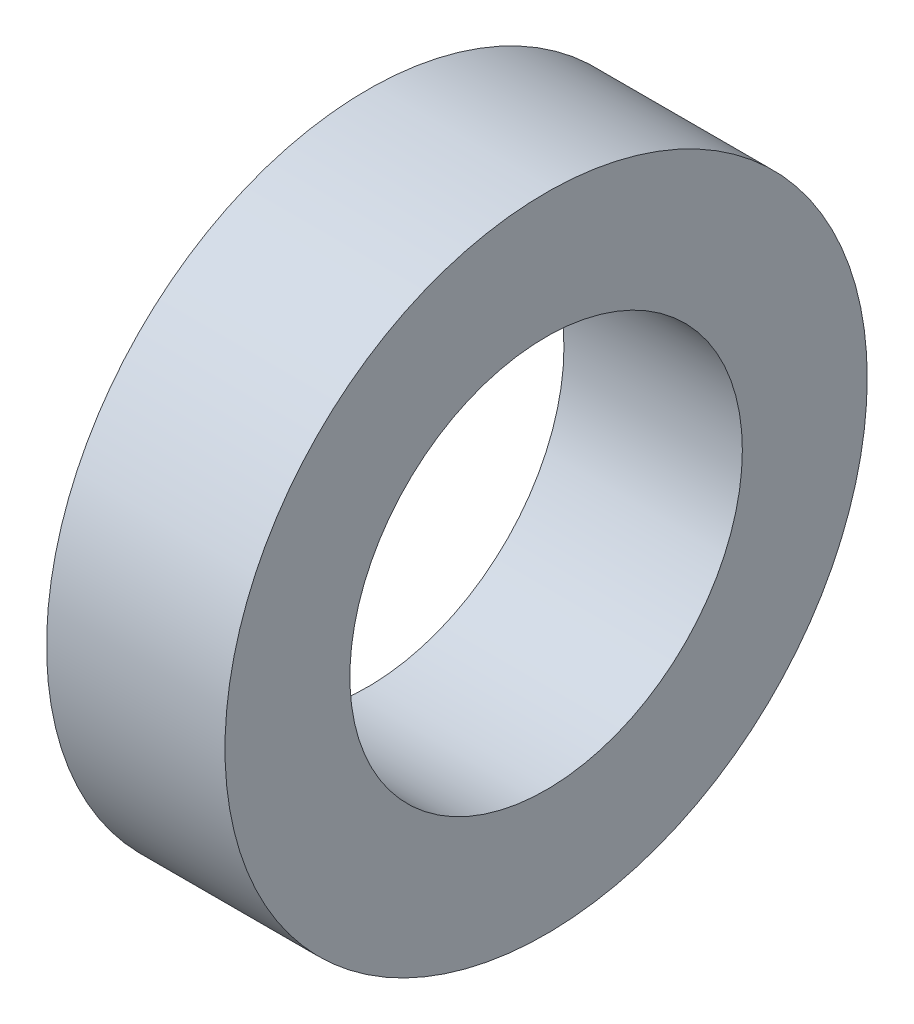
ISO-10303-21;
HEADER;
FILE_DESCRIPTION(('STEP AP214'),'2;1');
FILE_NAME('part.step','',(''),(''),'','','');
FILE_SCHEMA(('AUTOMOTIVE_DESIGN { 1 0 10303 214 1 1 1 1 }'));
ENDSEC;
DATA;
#1=APPLICATION_CONTEXT('core data for automotive mechanical design processes');
#2=APPLICATION_PROTOCOL_DEFINITION('international standard','automotive_design',2000,#1);
#3=PRODUCT_CONTEXT('',#1,'mechanical');
#4=PRODUCT('Part','Part','',(#3));
#5=PRODUCT_RELATED_PRODUCT_CATEGORY('part','',(#4));
#6=PRODUCT_DEFINITION_FORMATION('','',#4);
#7=PRODUCT_DEFINITION_CONTEXT('part definition',#1,'design');
#8=PRODUCT_DEFINITION('design','',#6,#7);
#9=PRODUCT_DEFINITION_SHAPE('','',#8);
#10=(LENGTH_UNIT() NAMED_UNIT(*) SI_UNIT(.MILLI.,.METRE.));
#11=(NAMED_UNIT(*) PLANE_ANGLE_UNIT() SI_UNIT($,.RADIAN.));
#12=(NAMED_UNIT(*) SI_UNIT($,.STERADIAN.) SOLID_ANGLE_UNIT());
#13=UNCERTAINTY_MEASURE_WITH_UNIT(LENGTH_MEASURE(1.E-05),#10,'distance_accuracy_value','');
#14=(GEOMETRIC_REPRESENTATION_CONTEXT(3) GLOBAL_UNCERTAINTY_ASSIGNED_CONTEXT((#13)) GLOBAL_UNIT_ASSIGNED_CONTEXT((#10,
#11,#12)) REPRESENTATION_CONTEXT('',''));
#15=CARTESIAN_POINT('',(0.,0.,0.));
#16=DIRECTION('',(0.,0.,1.));
#17=DIRECTION('',(1.,0.,0.));
#18=AXIS2_PLACEMENT_3D('',#15,#16,#17);
#19=CARTESIAN_POINT('',(65.,0.,-235.));
#20=DIRECTION('',(1.,0.,0.));
#21=DIRECTION('',(0.,0.,-1.));
#22=AXIS2_PLACEMENT_3D('',#19,#20,#21);
#23=CYLINDRICAL_SURFACE('',#22,11.);
#24=CARTESIAN_POINT('',(65.,0.,-235.));
#25=DIRECTION('',(1.,0.,0.));
#26=DIRECTION('',(0.,0.,-1.));
#27=AXIS2_PLACEMENT_3D('',#24,#25,#26);
#28=CIRCLE('',#27,11.);
#29=CARTESIAN_POINT('',(65.,0.,-246.));
#30=VERTEX_POINT('',#29);
#31=EDGE_CURVE('E27',#30,#30,#28,.F.);
#32=ORIENTED_EDGE('',*,*,#31,.T.);
#33=EDGE_LOOP('',(#32));
#34=FACE_BOUND('',#33,.T.);
#35=CARTESIAN_POINT('',(75.,0.,-235.));
#36=DIRECTION('',(1.,0.,0.));
#37=DIRECTION('',(0.,0.,-1.));
#38=AXIS2_PLACEMENT_3D('',#35,#36,#37);
#39=CIRCLE('',#38,11.);
#40=CARTESIAN_POINT('',(75.,0.,-246.));
#41=VERTEX_POINT('',#40);
#42=EDGE_CURVE('E18',#41,#41,#39,.F.);
#43=ORIENTED_EDGE('',*,*,#42,.F.);
#44=EDGE_LOOP('',(#43));
#45=FACE_BOUND('',#44,.T.);
#46=ADVANCED_FACE('F15',(#34,#45),#23,.F.);
#47=CARTESIAN_POINT('',(75.,0.,-235.));
#48=DIRECTION('',(1.,0.,0.));
#49=DIRECTION('',(0.,0.,-1.));
#50=AXIS2_PLACEMENT_3D('',#47,#48,#49);
#51=PLANE('',#50);
#52=ORIENTED_EDGE('',*,*,#42,.T.);
#53=EDGE_LOOP('',(#52));
#54=FACE_BOUND('',#53,.T.);
#55=CARTESIAN_POINT('',(75.,0.,-235.));
#56=DIRECTION('',(1.,0.,0.));
#57=DIRECTION('',(0.,0.,-1.));
#58=AXIS2_PLACEMENT_3D('',#55,#56,#57);
#59=CIRCLE('',#58,18.);
#60=CARTESIAN_POINT('',(75.,0.,-253.));
#61=VERTEX_POINT('',#60);
#62=EDGE_CURVE('E22',#61,#61,#59,.F.);
#63=ORIENTED_EDGE('',*,*,#62,.F.);
#64=EDGE_LOOP('',(#63));
#65=FACE_BOUND('',#64,.T.);
#66=ADVANCED_FACE('F35',(#54,#65),#51,.T.);
#67=CARTESIAN_POINT('',(65.,0.,-235.));
#68=DIRECTION('',(1.,0.,0.));
#69=DIRECTION('',(0.,0.,-1.));
#70=AXIS2_PLACEMENT_3D('',#67,#68,#69);
#71=PLANE('',#70);
#72=ORIENTED_EDGE('',*,*,#31,.F.);
#73=EDGE_LOOP('',(#72));
#74=FACE_BOUND('',#73,.T.);
#75=CARTESIAN_POINT('',(65.,0.,-235.));
#76=DIRECTION('',(1.,0.,0.));
#77=DIRECTION('',(0.,0.,-1.));
#78=AXIS2_PLACEMENT_3D('',#75,#76,#77);
#79=CIRCLE('',#78,18.);
#80=CARTESIAN_POINT('',(65.,0.,-253.));
#81=VERTEX_POINT('',#80);
#82=EDGE_CURVE('E10',#81,#81,#79,.T.);
#83=ORIENTED_EDGE('',*,*,#82,.F.);
#84=EDGE_LOOP('',(#83));
#85=FACE_BOUND('',#84,.T.);
#86=ADVANCED_FACE('F43',(#74,#85),#71,.F.);
#87=CARTESIAN_POINT('',(65.,0.,-235.));
#88=DIRECTION('',(1.,0.,0.));
#89=DIRECTION('',(0.,0.,-1.));
#90=AXIS2_PLACEMENT_3D('',#87,#88,#89);
#91=CYLINDRICAL_SURFACE('',#90,18.);
#92=ORIENTED_EDGE('',*,*,#82,.T.);
#93=EDGE_LOOP('',(#92));
#94=FACE_BOUND('',#93,.T.);
#95=ORIENTED_EDGE('',*,*,#62,.T.);
#96=EDGE_LOOP('',(#95));
#97=FACE_BOUND('',#96,.T.);
#98=ADVANCED_FACE('F44',(#94,#97),#91,.T.);
#99=CLOSED_SHELL('',(#46,#66,#86,#98));
#100=MANIFOLD_SOLID_BREP('B1',#99);
#101=ADVANCED_BREP_SHAPE_REPRESENTATION('',(#18,#100),#14);
#102=SHAPE_DEFINITION_REPRESENTATION(#9,#101);
ENDSEC;
END-ISO-10303-21;
